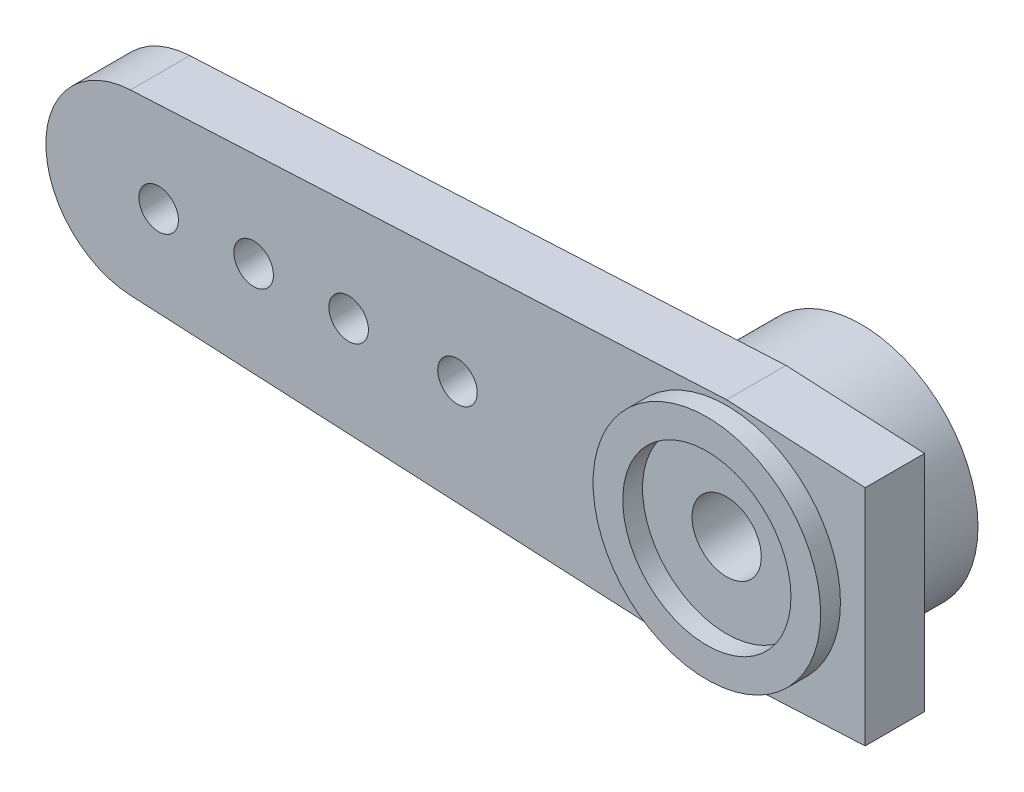
ISO-10303-21;
HEADER;
FILE_DESCRIPTION(('STEP AP214'),'2;1');
FILE_NAME('part.step','',(''),(''),'','','');
FILE_SCHEMA(('AUTOMOTIVE_DESIGN { 1 0 10303 214 1 1 1 1 }'));
ENDSEC;
DATA;
#1=APPLICATION_CONTEXT('core data for automotive mechanical design processes');
#2=APPLICATION_PROTOCOL_DEFINITION('international standard','automotive_design',2000,#1);
#3=PRODUCT_CONTEXT('',#1,'mechanical');
#4=PRODUCT('Part','Part','',(#3));
#5=PRODUCT_RELATED_PRODUCT_CATEGORY('part','',(#4));
#6=PRODUCT_DEFINITION_FORMATION('','',#4);
#7=PRODUCT_DEFINITION_CONTEXT('part definition',#1,'design');
#8=PRODUCT_DEFINITION('design','',#6,#7);
#9=PRODUCT_DEFINITION_SHAPE('','',#8);
#10=(LENGTH_UNIT() NAMED_UNIT(*) SI_UNIT(.MILLI.,.METRE.));
#11=(NAMED_UNIT(*) PLANE_ANGLE_UNIT() SI_UNIT($,.RADIAN.));
#12=(NAMED_UNIT(*) SI_UNIT($,.STERADIAN.) SOLID_ANGLE_UNIT());
#13=UNCERTAINTY_MEASURE_WITH_UNIT(LENGTH_MEASURE(1.E-05),#10,'distance_accuracy_value','');
#14=(GEOMETRIC_REPRESENTATION_CONTEXT(3) GLOBAL_UNCERTAINTY_ASSIGNED_CONTEXT((#13)) GLOBAL_UNIT_ASSIGNED_CONTEXT((#10,
#11,#12)) REPRESENTATION_CONTEXT('',''));
#15=CARTESIAN_POINT('',(0.,0.,0.));
#16=DIRECTION('',(0.,0.,1.));
#17=DIRECTION('',(1.,0.,0.));
#18=AXIS2_PLACEMENT_3D('',#15,#16,#17);
#19=CARTESIAN_POINT('',(14.95,0.,3.4));
#20=DIRECTION('',(0.,0.,1.));
#21=DIRECTION('',(1.,0.,0.));
#22=AXIS2_PLACEMENT_3D('',#19,#20,#21);
#23=PLANE('',#22);
#24=CARTESIAN_POINT('',(0.,0.,3.4));
#25=DIRECTION('',(0.,0.,1.));
#26=DIRECTION('',(1.,0.,0.));
#27=AXIS2_PLACEMENT_3D('',#24,#25,#26);
#28=CIRCLE('',#27,0.875);
#29=CARTESIAN_POINT('',(0.875,0.,3.4));
#30=VERTEX_POINT('',#29);
#31=EDGE_CURVE('E127',#30,#30,#28,.T.);
#32=ORIENTED_EDGE('',*,*,#31,.F.);
#33=EDGE_LOOP('',(#32));
#34=FACE_BOUND('',#33,.T.);
#35=CARTESIAN_POINT('',(0.,0.,3.4));
#36=DIRECTION('',(0.,0.,1.));
#37=DIRECTION('',(1.,0.,0.));
#38=AXIS2_PLACEMENT_3D('',#35,#36,#37);
#39=CIRCLE('',#38,2.125);
#40=CARTESIAN_POINT('',(2.125,0.,3.4));
#41=VERTEX_POINT('',#40);
#42=EDGE_CURVE('E42',#41,#41,#39,.F.);
#43=ORIENTED_EDGE('',*,*,#42,.F.);
#44=EDGE_LOOP('',(#43));
#45=FACE_BOUND('',#44,.T.);
#46=ADVANCED_FACE('F34',(#34,#45),#23,.T.);
#47=CARTESIAN_POINT('',(0.,0.,0.));
#48=DIRECTION('',(0.,0.,1.));
#49=DIRECTION('',(1.,0.,0.));
#50=AXIS2_PLACEMENT_3D('',#47,#48,#49);
#51=PLANE('',#50);
#52=CARTESIAN_POINT('',(0.,0.,0.));
#53=DIRECTION('',(0.,0.,1.));
#54=DIRECTION('',(1.,0.,0.));
#55=AXIS2_PLACEMENT_3D('',#52,#53,#54);
#56=CIRCLE('',#55,2.95);
#57=CARTESIAN_POINT('',(-2.95,0.,0.));
#58=VERTEX_POINT('',#57);
#59=EDGE_CURVE('E145',#58,#58,#56,.T.);
#60=ORIENTED_EDGE('',*,*,#59,.F.);
#61=EDGE_LOOP('',(#60));
#62=FACE_BOUND('',#61,.T.);
#63=CARTESIAN_POINT('',(0.,0.,0.));
#64=DIRECTION('',(0.,0.,1.));
#65=DIRECTION('',(1.,0.,0.));
#66=AXIS2_PLACEMENT_3D('',#63,#64,#65);
#67=CIRCLE('',#66,2.25);
#68=CARTESIAN_POINT('',(-2.25,0.,0.));
#69=VERTEX_POINT('',#68);
#70=EDGE_CURVE('E142',#69,#69,#67,.T.);
#71=ORIENTED_EDGE('',*,*,#70,.T.);
#72=EDGE_LOOP('',(#71));
#73=FACE_BOUND('',#72,.T.);
#74=ADVANCED_FACE('F156',(#62,#73),#51,.F.);
#75=CARTESIAN_POINT('',(0.,0.,1.9));
#76=DIRECTION('',(0.,0.,-1.));
#77=DIRECTION('',(-1.,0.,0.));
#78=AXIS2_PLACEMENT_3D('',#75,#76,#77);
#79=CYLINDRICAL_SURFACE('',#78,2.95);
#80=CARTESIAN_POINT('',(0.,0.,1.9));
#81=DIRECTION('',(0.,0.,1.));
#82=DIRECTION('',(1.,0.,0.));
#83=AXIS2_PLACEMENT_3D('',#80,#81,#82);
#84=CIRCLE('',#83,2.95);
#85=CARTESIAN_POINT('',(-2.95,0.,1.9));
#86=VERTEX_POINT('',#85);
#87=EDGE_CURVE('E146',#86,#86,#84,.T.);
#88=CARTESIAN_POINT('',(-2.95,0.,1.9));
#89=CARTESIAN_POINT('',(-2.95,0.,1.88020833333333));
#90=CARTESIAN_POINT('',(-2.95,0.,1.86041666666667));
#91=CARTESIAN_POINT('',(-2.95,0.,1.82083333333333));
#92=CARTESIAN_POINT('',(-2.95,0.,1.80104166666667));
#93=CARTESIAN_POINT('',(-2.95,0.,1.76145833333333));
#94=CARTESIAN_POINT('',(-2.95,0.,1.74166666666667));
#95=CARTESIAN_POINT('',(-2.95,0.,1.70208333333333));
#96=CARTESIAN_POINT('',(-2.95,0.,1.68229166666667));
#97=CARTESIAN_POINT('',(-2.95,0.,1.64270833333333));
#98=CARTESIAN_POINT('',(-2.95,0.,1.62291666666667));
#99=CARTESIAN_POINT('',(-2.95,0.,1.58333333333333));
#100=CARTESIAN_POINT('',(-2.95,0.,1.56354166666667));
#101=CARTESIAN_POINT('',(-2.95,0.,1.52395833333333));
#102=CARTESIAN_POINT('',(-2.95,0.,1.50416666666667));
#103=CARTESIAN_POINT('',(-2.95,0.,1.46458333333333));
#104=CARTESIAN_POINT('',(-2.95,0.,1.44479166666667));
#105=CARTESIAN_POINT('',(-2.95,0.,1.40520833333333));
#106=CARTESIAN_POINT('',(-2.95,0.,1.38541666666667));
#107=CARTESIAN_POINT('',(-2.95,0.,1.34583333333333));
#108=CARTESIAN_POINT('',(-2.95,0.,1.32604166666667));
#109=CARTESIAN_POINT('',(-2.95,0.,1.28645833333333));
#110=CARTESIAN_POINT('',(-2.95,0.,1.26666666666667));
#111=CARTESIAN_POINT('',(-2.95,0.,1.22708333333333));
#112=CARTESIAN_POINT('',(-2.95,0.,1.20729166666667));
#113=CARTESIAN_POINT('',(-2.95,0.,1.16770833333333));
#114=CARTESIAN_POINT('',(-2.95,0.,1.14791666666667));
#115=CARTESIAN_POINT('',(-2.95,0.,1.10833333333333));
#116=CARTESIAN_POINT('',(-2.95,0.,1.08854166666667));
#117=CARTESIAN_POINT('',(-2.95,0.,1.04895833333333));
#118=CARTESIAN_POINT('',(-2.95,0.,1.02916666666667));
#119=CARTESIAN_POINT('',(-2.95,0.,0.989583333333333));
#120=CARTESIAN_POINT('',(-2.95,0.,0.969791666666667));
#121=CARTESIAN_POINT('',(-2.95,0.,0.930208333333333));
#122=CARTESIAN_POINT('',(-2.95,0.,0.910416666666667));
#123=CARTESIAN_POINT('',(-2.95,0.,0.870833333333333));
#124=CARTESIAN_POINT('',(-2.95,0.,0.851041666666667));
#125=CARTESIAN_POINT('',(-2.95,0.,0.811458333333333));
#126=CARTESIAN_POINT('',(-2.95,0.,0.791666666666667));
#127=CARTESIAN_POINT('',(-2.95,0.,0.752083333333333));
#128=CARTESIAN_POINT('',(-2.95,0.,0.732291666666667));
#129=CARTESIAN_POINT('',(-2.95,0.,0.692708333333333));
#130=CARTESIAN_POINT('',(-2.95,0.,0.672916666666667));
#131=CARTESIAN_POINT('',(-2.95,0.,0.633333333333333));
#132=CARTESIAN_POINT('',(-2.95,0.,0.613541666666667));
#133=CARTESIAN_POINT('',(-2.95,0.,0.573958333333333));
#134=CARTESIAN_POINT('',(-2.95,0.,0.554166666666667));
#135=CARTESIAN_POINT('',(-2.95,0.,0.514583333333333));
#136=CARTESIAN_POINT('',(-2.95,0.,0.494791666666667));
#137=CARTESIAN_POINT('',(-2.95,0.,0.455208333333333));
#138=CARTESIAN_POINT('',(-2.95,0.,0.435416666666667));
#139=CARTESIAN_POINT('',(-2.95,0.,0.395833333333333));
#140=CARTESIAN_POINT('',(-2.95,0.,0.376041666666667));
#141=CARTESIAN_POINT('',(-2.95,0.,0.336458333333333));
#142=CARTESIAN_POINT('',(-2.95,0.,0.316666666666667));
#143=CARTESIAN_POINT('',(-2.95,0.,0.277083333333333));
#144=CARTESIAN_POINT('',(-2.95,0.,0.257291666666667));
#145=CARTESIAN_POINT('',(-2.95,0.,0.217708333333333));
#146=CARTESIAN_POINT('',(-2.95,0.,0.197916666666667));
#147=CARTESIAN_POINT('',(-2.95,0.,0.158333333333333));
#148=CARTESIAN_POINT('',(-2.95,0.,0.138541666666667));
#149=CARTESIAN_POINT('',(-2.95,0.,0.0989583333333333));
#150=CARTESIAN_POINT('',(-2.95,0.,0.0791666666666666));
#151=CARTESIAN_POINT('',(-2.95,0.,0.0395833333333333));
#152=CARTESIAN_POINT('',(-2.95,0.,0.0197916666666666));
#153=CARTESIAN_POINT('',(-2.95,0.,0.));
#154=B_SPLINE_CURVE_WITH_KNOTS('',3,(#88,#89,#90,#91,#92,#93,#94,#95,#96,#97,#98,#99,#100,#101,
#102,#103,#104,#105,#106,#107,#108,#109,#110,#111,#112,#113,#114,#115,#116,#117,#118,#119,#120,
#121,#122,#123,#124,#125,#126,#127,#128,#129,#130,#131,#132,#133,#134,#135,#136,#137,#138,#139,
#140,#141,#142,#143,#144,#145,#146,#147,#148,#149,#150,#151,#152,#153),.UNSPECIFIED.,.F.,.F.,(4,
2,2,2,2,2,2,2,2,2,2,2,2,2,2,2,2,2,2,2,2,2,2,2,2,2,2,2,2,2,2,2,4),(0.,0.059375,0.11875,0.178125,
0.2375,0.296875,0.35625,0.415625,0.475,0.534375,0.59375,0.653125,0.7125,0.771875,0.83125,
0.890625,0.95,1.009375,1.06875,1.128125,1.1875,1.246875,1.30625,1.365625,1.425,1.484375,1.54375,
1.603125,1.6625,1.721875,1.78125,1.840625,1.9),.UNSPECIFIED.);
#155=EDGE_CURVE('BSEAM36',#86,#58,#154,.T.);
#156=ORIENTED_EDGE('',*,*,#87,.F.);
#157=ORIENTED_EDGE('',*,*,#59,.T.);
#158=ORIENTED_EDGE('',*,*,#155,.T.);
#159=ORIENTED_EDGE('',*,*,#155,.F.);
#160=EDGE_LOOP('',(#156,#158,#157,#159));
#161=FACE_BOUND('',#160,.T.);
#162=ADVANCED_FACE('F36',(#161),#79,.T.);
#163=CARTESIAN_POINT('',(0.,0.,1.9));
#164=DIRECTION('',(0.,0.,-1.));
#165=DIRECTION('',(-1.,0.,0.));
#166=AXIS2_PLACEMENT_3D('',#163,#164,#165);
#167=CYLINDRICAL_SURFACE('',#166,2.25);
#168=CARTESIAN_POINT('',(0.,0.,1.9));
#169=DIRECTION('',(0.,0.,1.));
#170=DIRECTION('',(1.,0.,0.));
#171=AXIS2_PLACEMENT_3D('',#168,#169,#170);
#172=CIRCLE('',#171,2.25);
#173=CARTESIAN_POINT('',(-2.25,0.,1.9));
#174=VERTEX_POINT('',#173);
#175=EDGE_CURVE('E139',#174,#174,#172,.T.);
#176=CARTESIAN_POINT('',(-2.25,0.,1.9));
#177=CARTESIAN_POINT('',(-2.25,0.,1.88020833333333));
#178=CARTESIAN_POINT('',(-2.25,0.,1.86041666666667));
#179=CARTESIAN_POINT('',(-2.25,0.,1.82083333333333));
#180=CARTESIAN_POINT('',(-2.25,0.,1.80104166666667));
#181=CARTESIAN_POINT('',(-2.25,0.,1.76145833333333));
#182=CARTESIAN_POINT('',(-2.25,0.,1.74166666666667));
#183=CARTESIAN_POINT('',(-2.25,0.,1.70208333333333));
#184=CARTESIAN_POINT('',(-2.25,0.,1.68229166666667));
#185=CARTESIAN_POINT('',(-2.25,0.,1.64270833333333));
#186=CARTESIAN_POINT('',(-2.25,0.,1.62291666666667));
#187=CARTESIAN_POINT('',(-2.25,0.,1.58333333333333));
#188=CARTESIAN_POINT('',(-2.25,0.,1.56354166666667));
#189=CARTESIAN_POINT('',(-2.25,0.,1.52395833333333));
#190=CARTESIAN_POINT('',(-2.25,0.,1.50416666666667));
#191=CARTESIAN_POINT('',(-2.25,0.,1.46458333333333));
#192=CARTESIAN_POINT('',(-2.25,0.,1.44479166666667));
#193=CARTESIAN_POINT('',(-2.25,0.,1.40520833333333));
#194=CARTESIAN_POINT('',(-2.25,0.,1.38541666666667));
#195=CARTESIAN_POINT('',(-2.25,0.,1.34583333333333));
#196=CARTESIAN_POINT('',(-2.25,0.,1.32604166666667));
#197=CARTESIAN_POINT('',(-2.25,0.,1.28645833333333));
#198=CARTESIAN_POINT('',(-2.25,0.,1.26666666666667));
#199=CARTESIAN_POINT('',(-2.25,0.,1.22708333333333));
#200=CARTESIAN_POINT('',(-2.25,0.,1.20729166666667));
#201=CARTESIAN_POINT('',(-2.25,0.,1.16770833333333));
#202=CARTESIAN_POINT('',(-2.25,0.,1.14791666666667));
#203=CARTESIAN_POINT('',(-2.25,0.,1.10833333333333));
#204=CARTESIAN_POINT('',(-2.25,0.,1.08854166666667));
#205=CARTESIAN_POINT('',(-2.25,0.,1.04895833333333));
#206=CARTESIAN_POINT('',(-2.25,0.,1.02916666666667));
#207=CARTESIAN_POINT('',(-2.25,0.,0.989583333333333));
#208=CARTESIAN_POINT('',(-2.25,0.,0.969791666666667));
#209=CARTESIAN_POINT('',(-2.25,0.,0.930208333333333));
#210=CARTESIAN_POINT('',(-2.25,0.,0.910416666666667));
#211=CARTESIAN_POINT('',(-2.25,0.,0.870833333333333));
#212=CARTESIAN_POINT('',(-2.25,0.,0.851041666666667));
#213=CARTESIAN_POINT('',(-2.25,0.,0.811458333333333));
#214=CARTESIAN_POINT('',(-2.25,0.,0.791666666666667));
#215=CARTESIAN_POINT('',(-2.25,0.,0.752083333333333));
#216=CARTESIAN_POINT('',(-2.25,0.,0.732291666666667));
#217=CARTESIAN_POINT('',(-2.25,0.,0.692708333333333));
#218=CARTESIAN_POINT('',(-2.25,0.,0.672916666666667));
#219=CARTESIAN_POINT('',(-2.25,0.,0.633333333333333));
#220=CARTESIAN_POINT('',(-2.25,0.,0.613541666666667));
#221=CARTESIAN_POINT('',(-2.25,0.,0.573958333333333));
#222=CARTESIAN_POINT('',(-2.25,0.,0.554166666666667));
#223=CARTESIAN_POINT('',(-2.25,0.,0.514583333333333));
#224=CARTESIAN_POINT('',(-2.25,0.,0.494791666666667));
#225=CARTESIAN_POINT('',(-2.25,0.,0.455208333333333));
#226=CARTESIAN_POINT('',(-2.25,0.,0.435416666666667));
#227=CARTESIAN_POINT('',(-2.25,0.,0.395833333333333));
#228=CARTESIAN_POINT('',(-2.25,0.,0.376041666666667));
#229=CARTESIAN_POINT('',(-2.25,0.,0.336458333333333));
#230=CARTESIAN_POINT('',(-2.25,0.,0.316666666666667));
#231=CARTESIAN_POINT('',(-2.25,0.,0.277083333333333));
#232=CARTESIAN_POINT('',(-2.25,0.,0.257291666666667));
#233=CARTESIAN_POINT('',(-2.25,0.,0.217708333333333));
#234=CARTESIAN_POINT('',(-2.25,0.,0.197916666666667));
#235=CARTESIAN_POINT('',(-2.25,0.,0.158333333333333));
#236=CARTESIAN_POINT('',(-2.25,0.,0.138541666666667));
#237=CARTESIAN_POINT('',(-2.25,0.,0.0989583333333333));
#238=CARTESIAN_POINT('',(-2.25,0.,0.0791666666666666));
#239=CARTESIAN_POINT('',(-2.25,0.,0.0395833333333333));
#240=CARTESIAN_POINT('',(-2.25,0.,0.0197916666666666));
#241=CARTESIAN_POINT('',(-2.25,0.,0.));
#242=B_SPLINE_CURVE_WITH_KNOTS('',3,(#176,#177,#178,#179,#180,#181,#182,#183,#184,#185,#186,
#187,#188,#189,#190,#191,#192,#193,#194,#195,#196,#197,#198,#199,#200,#201,#202,#203,#204,#205,
#206,#207,#208,#209,#210,#211,#212,#213,#214,#215,#216,#217,#218,#219,#220,#221,#222,#223,#224,
#225,#226,#227,#228,#229,#230,#231,#232,#233,#234,#235,#236,#237,#238,#239,#240,#241),
.UNSPECIFIED.,.F.,.F.,(4,2,2,2,2,2,2,2,2,2,2,2,2,2,2,2,2,2,2,2,2,2,2,2,2,2,2,2,2,2,2,2,4),(0.,
0.059375,0.11875,0.178125,0.2375,0.296875,0.35625,0.415625,0.475,0.534375,0.59375,0.653125,
0.7125,0.771875,0.83125,0.890625,0.95,1.009375,1.06875,1.128125,1.1875,1.246875,1.30625,
1.365625,1.425,1.484375,1.54375,1.603125,1.6625,1.721875,1.78125,1.840625,1.9),.UNSPECIFIED.);
#243=EDGE_CURVE('BSEAM174',#174,#69,#242,.T.);
#244=ORIENTED_EDGE('',*,*,#175,.T.);
#245=ORIENTED_EDGE('',*,*,#70,.F.);
#246=ORIENTED_EDGE('',*,*,#243,.T.);
#247=ORIENTED_EDGE('',*,*,#243,.F.);
#248=EDGE_LOOP('',(#244,#246,#245,#247));
#249=FACE_BOUND('',#248,.T.);
#250=ADVANCED_FACE('F174',(#249),#167,.F.);
#251=CARTESIAN_POINT('',(14.95,0.,1.9));
#252=DIRECTION('',(0.,0.,1.));
#253=DIRECTION('',(1.,0.,0.));
#254=AXIS2_PLACEMENT_3D('',#251,#252,#253);
#255=PLANE('',#254);
#256=CARTESIAN_POINT('',(0.,0.,1.9));
#257=DIRECTION('',(0.,0.,1.));
#258=DIRECTION('',(1.,0.,0.));
#259=AXIS2_PLACEMENT_3D('',#256,#257,#258);
#260=CIRCLE('',#259,0.875);
#261=CARTESIAN_POINT('',(0.875,0.,1.9));
#262=VERTEX_POINT('',#261);
#263=EDGE_CURVE('E117',#262,#262,#260,.T.);
#264=ORIENTED_EDGE('',*,*,#263,.T.);
#265=EDGE_LOOP('',(#264));
#266=FACE_BOUND('',#265,.T.);
#267=ORIENTED_EDGE('',*,*,#175,.F.);
#268=EDGE_LOOP('',(#267));
#269=FACE_BOUND('',#268,.T.);
#270=ADVANCED_FACE('F168',(#266,#269),#255,.F.);
#271=DIRECTION('',(0.,-1.,0.));
#272=VECTOR('',#271,1.);
#273=CARTESIAN_POINT('',(3.5,2.82507220694701,3.4));
#274=LINE('',#273,#272);
#275=CARTESIAN_POINT('',(3.5,2.82507220694701,3.4));
#276=VERTEX_POINT('',#275);
#277=CARTESIAN_POINT('',(3.5,-2.82507220694701,3.4));
#278=VERTEX_POINT('',#277);
#279=EDGE_CURVE('E49',#276,#278,#274,.T.);
#280=ORIENTED_EDGE('',*,*,#279,.F.);
#281=DIRECTION('',(-0.998753366339054,0.0499170634794085,0.));
#282=VECTOR('',#281,1.);
#283=CARTESIAN_POINT('',(15.0623133928287,2.24719507426287,3.4));
#284=LINE('',#283,#282);
#285=CARTESIAN_POINT('',(0.,3.,3.4));
#286=VERTEX_POINT('',#285);
#287=EDGE_CURVE('E84',#276,#286,#284,.T.);
#288=ORIENTED_EDGE('',*,*,#287,.T.);
#289=DIRECTION('',(-0.998753366339054,-0.0499170634794085,0.));
#290=VECTOR('',#289,1.);
#291=CARTESIAN_POINT('',(-15.0623133928287,2.24719507426287,3.4));
#292=LINE('',#291,#290);
#293=CARTESIAN_POINT('',(-15.0623133928287,2.24719507426287,3.4));
#294=VERTEX_POINT('',#293);
#295=EDGE_CURVE('E109',#286,#294,#292,.T.);
#296=ORIENTED_EDGE('',*,*,#295,.T.);
#297=CARTESIAN_POINT('',(-14.95,0.,3.4));
#298=DIRECTION('',(0.,0.,1.));
#299=DIRECTION('',(-1.,0.,0.));
#300=AXIS2_PLACEMENT_3D('',#297,#298,#299);
#301=CIRCLE('',#300,2.25);
#302=CARTESIAN_POINT('',(-15.0623133928287,-2.24719507426288,3.4));
#303=VERTEX_POINT('',#302);
#304=EDGE_CURVE('E112',#294,#303,#301,.T.);
#305=ORIENTED_EDGE('',*,*,#304,.T.);
#306=DIRECTION('',(0.998753366339054,-0.0499170634794085,0.));
#307=VECTOR('',#306,1.);
#308=CARTESIAN_POINT('',(-15.0623133928287,-2.24719507426287,3.4));
#309=LINE('',#308,#307);
#310=CARTESIAN_POINT('',(0.,-3.,3.4));
#311=VERTEX_POINT('',#310);
#312=EDGE_CURVE('E57',#303,#311,#309,.T.);
#313=ORIENTED_EDGE('',*,*,#312,.T.);
#314=DIRECTION('',(0.998753366339054,0.0499170634794085,0.));
#315=VECTOR('',#314,1.);
#316=CARTESIAN_POINT('',(15.0623133928287,-2.24719507426287,3.4));
#317=LINE('',#316,#315);
#318=EDGE_CURVE('E103',#311,#278,#317,.T.);
#319=ORIENTED_EDGE('',*,*,#318,.T.);
#320=EDGE_LOOP('',(#280,#288,#296,#305,#313,#319));
#321=FACE_BOUND('',#320,.T.);
#322=CARTESIAN_POINT('',(0.,0.,3.4));
#323=DIRECTION('',(0.,0.,1.));
#324=DIRECTION('',(1.,0.,0.));
#325=AXIS2_PLACEMENT_3D('',#322,#323,#324);
#326=CIRCLE('',#325,2.875);
#327=CARTESIAN_POINT('',(2.875,0.,3.4));
#328=VERTEX_POINT('',#327);
#329=EDGE_CURVE('E385',#328,#328,#326,.T.);
#330=ORIENTED_EDGE('',*,*,#329,.F.);
#331=EDGE_LOOP('',(#330));
#332=FACE_BOUND('',#331,.T.);
#333=CARTESIAN_POINT('',(-9.55,0.,3.4));
#334=DIRECTION('',(0.,0.,1.));
#335=DIRECTION('',(-1.,0.,0.));
#336=AXIS2_PLACEMENT_3D('',#333,#334,#335);
#337=CIRCLE('',#336,0.500000000000001);
#338=CARTESIAN_POINT('',(-10.05,0.,3.4));
#339=VERTEX_POINT('',#338);
#340=EDGE_CURVE('E389',#339,#339,#337,.T.);
#341=ORIENTED_EDGE('',*,*,#340,.F.);
#342=EDGE_LOOP('',(#341));
#343=FACE_BOUND('',#342,.T.);
#344=CARTESIAN_POINT('',(-14.35,0.,3.4));
#345=DIRECTION('',(0.,0.,1.));
#346=DIRECTION('',(-1.,0.,0.));
#347=AXIS2_PLACEMENT_3D('',#344,#345,#346);
#348=CIRCLE('',#347,0.500000000000001);
#349=CARTESIAN_POINT('',(-14.85,0.,3.4));
#350=VERTEX_POINT('',#349);
#351=EDGE_CURVE('E397',#350,#350,#348,.T.);
#352=ORIENTED_EDGE('',*,*,#351,.F.);
#353=EDGE_LOOP('',(#352));
#354=FACE_BOUND('',#353,.T.);
#355=CARTESIAN_POINT('',(-11.95,0.,3.4));
#356=DIRECTION('',(0.,0.,1.));
#357=DIRECTION('',(-1.,0.,0.));
#358=AXIS2_PLACEMENT_3D('',#355,#356,#357);
#359=CIRCLE('',#358,0.500000000000001);
#360=CARTESIAN_POINT('',(-12.45,0.,3.4));
#361=VERTEX_POINT('',#360);
#362=EDGE_CURVE('E393',#361,#361,#359,.T.);
#363=ORIENTED_EDGE('',*,*,#362,.F.);
#364=EDGE_LOOP('',(#363));
#365=FACE_BOUND('',#364,.T.);
#366=CARTESIAN_POINT('',(-6.8,0.,3.4));
#367=DIRECTION('',(0.,0.,1.));
#368=DIRECTION('',(-1.,0.,0.));
#369=AXIS2_PLACEMENT_3D('',#366,#367,#368);
#370=CIRCLE('',#369,0.500000000000001);
#371=CARTESIAN_POINT('',(-7.3,0.,3.4));
#372=VERTEX_POINT('',#371);
#373=EDGE_CURVE('E379',#372,#372,#370,.T.);
#374=ORIENTED_EDGE('',*,*,#373,.F.);
#375=EDGE_LOOP('',(#374));
#376=FACE_BOUND('',#375,.T.);
#377=ADVANCED_FACE('F100',(#321,#332,#343,#354,#365,#376),#23,.T.);
#378=ORIENTED_EDGE('',*,*,#87,.T.);
#379=EDGE_LOOP('',(#378));
#380=FACE_BOUND('',#379,.T.);
#381=DIRECTION('',(-0.998753366339054,0.0499170634794085,0.));
#382=VECTOR('',#381,1.);
#383=CARTESIAN_POINT('',(15.0623133928287,2.24719507426287,1.9));
#384=LINE('',#383,#382);
#385=CARTESIAN_POINT('',(3.5,2.82507220694701,1.9));
#386=VERTEX_POINT('',#385);
#387=CARTESIAN_POINT('',(0.,3.,1.9));
#388=VERTEX_POINT('',#387);
#389=EDGE_CURVE('E124',#386,#388,#384,.T.);
#390=ORIENTED_EDGE('',*,*,#389,.F.);
#391=DIRECTION('',(0.,-1.,0.));
#392=VECTOR('',#391,1.);
#393=CARTESIAN_POINT('',(3.5,0.,1.9));
#394=LINE('',#393,#392);
#395=CARTESIAN_POINT('',(3.5,-2.82507220694701,1.9));
#396=VERTEX_POINT('',#395);
#397=EDGE_CURVE('E96',#386,#396,#394,.T.);
#398=ORIENTED_EDGE('',*,*,#397,.T.);
#399=DIRECTION('',(0.998753366339054,0.0499170634794085,0.));
#400=VECTOR('',#399,1.);
#401=CARTESIAN_POINT('',(15.0623133928287,-2.24719507426287,1.9));
#402=LINE('',#401,#400);
#403=CARTESIAN_POINT('',(0.,-3.,1.9));
#404=VERTEX_POINT('',#403);
#405=EDGE_CURVE('E110',#404,#396,#402,.T.);
#406=ORIENTED_EDGE('',*,*,#405,.F.);
#407=DIRECTION('',(0.998753366339054,-0.0499170634794085,0.));
#408=VECTOR('',#407,1.);
#409=CARTESIAN_POINT('',(-15.0623133928287,-2.24719507426287,1.9));
#410=LINE('',#409,#408);
#411=CARTESIAN_POINT('',(-15.0623133928287,-2.24719507426288,1.9));
#412=VERTEX_POINT('',#411);
#413=EDGE_CURVE('E78',#412,#404,#410,.T.);
#414=ORIENTED_EDGE('',*,*,#413,.F.);
#415=CARTESIAN_POINT('',(-14.95,0.,1.9));
#416=DIRECTION('',(0.,0.,1.));
#417=DIRECTION('',(-1.,0.,0.));
#418=AXIS2_PLACEMENT_3D('',#415,#416,#417);
#419=CIRCLE('',#418,2.25);
#420=CARTESIAN_POINT('',(-15.0623133928287,2.24719507426287,1.9));
#421=VERTEX_POINT('',#420);
#422=EDGE_CURVE('E129',#421,#412,#419,.T.);
#423=ORIENTED_EDGE('',*,*,#422,.F.);
#424=DIRECTION('',(-0.998753366339054,-0.0499170634794085,0.));
#425=VECTOR('',#424,1.);
#426=CARTESIAN_POINT('',(-15.0623133928287,2.24719507426287,1.9));
#427=LINE('',#426,#425);
#428=EDGE_CURVE('E126',#388,#421,#427,.T.);
#429=ORIENTED_EDGE('',*,*,#428,.F.);
#430=EDGE_LOOP('',(#390,#398,#406,#414,#423,#429));
#431=FACE_BOUND('',#430,.T.);
#432=CARTESIAN_POINT('',(-14.35,0.,1.9));
#433=DIRECTION('',(0.,0.,1.));
#434=DIRECTION('',(-1.,0.,0.));
#435=AXIS2_PLACEMENT_3D('',#432,#433,#434);
#436=CIRCLE('',#435,0.500000000000001);
#437=CARTESIAN_POINT('',(-14.85,0.,1.9));
#438=VERTEX_POINT('',#437);
#439=EDGE_CURVE('E366',#438,#438,#436,.T.);
#440=ORIENTED_EDGE('',*,*,#439,.T.);
#441=EDGE_LOOP('',(#440));
#442=FACE_BOUND('',#441,.T.);
#443=CARTESIAN_POINT('',(-11.95,0.,1.9));
#444=DIRECTION('',(0.,0.,1.));
#445=DIRECTION('',(-1.,0.,0.));
#446=AXIS2_PLACEMENT_3D('',#443,#444,#445);
#447=CIRCLE('',#446,0.500000000000001);
#448=CARTESIAN_POINT('',(-12.45,0.,1.9));
#449=VERTEX_POINT('',#448);
#450=EDGE_CURVE('E370',#449,#449,#447,.T.);
#451=ORIENTED_EDGE('',*,*,#450,.T.);
#452=EDGE_LOOP('',(#451));
#453=FACE_BOUND('',#452,.T.);
#454=CARTESIAN_POINT('',(-9.55,0.,1.9));
#455=DIRECTION('',(0.,0.,1.));
#456=DIRECTION('',(-1.,0.,0.));
#457=AXIS2_PLACEMENT_3D('',#454,#455,#456);
#458=CIRCLE('',#457,0.500000000000001);
#459=CARTESIAN_POINT('',(-10.05,0.,1.9));
#460=VERTEX_POINT('',#459);
#461=EDGE_CURVE('E374',#460,#460,#458,.T.);
#462=ORIENTED_EDGE('',*,*,#461,.T.);
#463=EDGE_LOOP('',(#462));
#464=FACE_BOUND('',#463,.T.);
#465=CARTESIAN_POINT('',(-6.8,0.,1.9));
#466=DIRECTION('',(0.,0.,1.));
#467=DIRECTION('',(-1.,0.,0.));
#468=AXIS2_PLACEMENT_3D('',#465,#466,#467);
#469=CIRCLE('',#468,0.500000000000001);
#470=CARTESIAN_POINT('',(-7.3,0.,1.9));
#471=VERTEX_POINT('',#470);
#472=EDGE_CURVE('E377',#471,#471,#469,.T.);
#473=ORIENTED_EDGE('',*,*,#472,.T.);
#474=EDGE_LOOP('',(#473));
#475=FACE_BOUND('',#474,.T.);
#476=ADVANCED_FACE('F167',(#380,#431,#442,#453,#464,#475),#255,.F.);
#477=CARTESIAN_POINT('',(15.0623133928287,2.24719507426287,3.4));
#478=DIRECTION('',(-0.0499170634794085,-0.998753366339054,0.));
#479=DIRECTION('',(0.998753366339054,-0.0499170634794085,0.));
#480=AXIS2_PLACEMENT_3D('',#477,#478,#479);
#481=PLANE('',#480);
#482=ORIENTED_EDGE('',*,*,#287,.F.);
#483=DIRECTION('',(0.,0.,1.));
#484=VECTOR('',#483,1.);
#485=CARTESIAN_POINT('',(3.5,2.82507220694701,-6.6));
#486=LINE('',#485,#484);
#487=EDGE_CURVE('E93',#386,#276,#486,.T.);
#488=ORIENTED_EDGE('',*,*,#487,.F.);
#489=ORIENTED_EDGE('',*,*,#389,.T.);
#490=DIRECTION('',(0.,0.,-1.));
#491=VECTOR('',#490,1.);
#492=CARTESIAN_POINT('',(0.,3.,3.4));
#493=LINE('',#492,#491);
#494=EDGE_CURVE('E107',#286,#388,#493,.T.);
#495=ORIENTED_EDGE('',*,*,#494,.F.);
#496=EDGE_LOOP('',(#482,#488,#489,#495));
#497=FACE_BOUND('',#496,.T.);
#498=ADVANCED_FACE('F105',(#497),#481,.F.);
#499=CARTESIAN_POINT('',(-15.0623133928287,2.24719507426287,3.4));
#500=DIRECTION('',(0.0499170634794085,-0.998753366339054,0.));
#501=DIRECTION('',(0.998753366339054,0.0499170634794085,0.));
#502=AXIS2_PLACEMENT_3D('',#499,#500,#501);
#503=PLANE('',#502);
#504=ORIENTED_EDGE('',*,*,#428,.T.);
#505=DIRECTION('',(0.,0.,-1.));
#506=VECTOR('',#505,1.);
#507=CARTESIAN_POINT('',(-15.0623133928287,2.24719507426287,3.4));
#508=LINE('',#507,#506);
#509=EDGE_CURVE('E135',#294,#421,#508,.T.);
#510=ORIENTED_EDGE('',*,*,#509,.F.);
#511=ORIENTED_EDGE('',*,*,#295,.F.);
#512=ORIENTED_EDGE('',*,*,#494,.T.);
#513=EDGE_LOOP('',(#504,#510,#511,#512));
#514=FACE_BOUND('',#513,.T.);
#515=ADVANCED_FACE('F195',(#514),#503,.F.);
#516=CARTESIAN_POINT('',(-14.95,0.,3.4));
#517=DIRECTION('',(0.,0.,-1.));
#518=DIRECTION('',(-1.,0.,0.));
#519=AXIS2_PLACEMENT_3D('',#516,#517,#518);
#520=CYLINDRICAL_SURFACE('',#519,2.25);
#521=ORIENTED_EDGE('',*,*,#422,.T.);
#522=DIRECTION('',(0.,0.,-1.));
#523=VECTOR('',#522,1.);
#524=CARTESIAN_POINT('',(-15.0623133928287,-2.24719507426288,3.4));
#525=LINE('',#524,#523);
#526=EDGE_CURVE('E133',#303,#412,#525,.T.);
#527=ORIENTED_EDGE('',*,*,#526,.F.);
#528=ORIENTED_EDGE('',*,*,#304,.F.);
#529=ORIENTED_EDGE('',*,*,#509,.T.);
#530=EDGE_LOOP('',(#521,#527,#528,#529));
#531=FACE_BOUND('',#530,.T.);
#532=ADVANCED_FACE('F192',(#531),#520,.T.);
#533=CARTESIAN_POINT('',(-15.0623133928287,-2.24719507426287,3.4));
#534=DIRECTION('',(0.0499170634794085,0.998753366339054,0.));
#535=DIRECTION('',(-0.998753366339054,0.0499170634794085,0.));
#536=AXIS2_PLACEMENT_3D('',#533,#534,#535);
#537=PLANE('',#536);
#538=ORIENTED_EDGE('',*,*,#413,.T.);
#539=DIRECTION('',(0.,0.,-1.));
#540=VECTOR('',#539,1.);
#541=CARTESIAN_POINT('',(0.,-3.,3.4));
#542=LINE('',#541,#540);
#543=EDGE_CURVE('E123',#311,#404,#542,.T.);
#544=ORIENTED_EDGE('',*,*,#543,.F.);
#545=ORIENTED_EDGE('',*,*,#312,.F.);
#546=ORIENTED_EDGE('',*,*,#526,.T.);
#547=EDGE_LOOP('',(#538,#544,#545,#546));
#548=FACE_BOUND('',#547,.T.);
#549=ADVANCED_FACE('F188',(#548),#537,.F.);
#550=CARTESIAN_POINT('',(15.0623133928287,-2.24719507426287,3.4));
#551=DIRECTION('',(-0.0499170634794085,0.998753366339054,0.));
#552=DIRECTION('',(-0.998753366339054,-0.0499170634794085,0.));
#553=AXIS2_PLACEMENT_3D('',#550,#551,#552);
#554=PLANE('',#553);
#555=ORIENTED_EDGE('',*,*,#405,.T.);
#556=DIRECTION('',(0.,0.,1.));
#557=VECTOR('',#556,1.);
#558=CARTESIAN_POINT('',(3.5,-2.82507220694701,3.4));
#559=LINE('',#558,#557);
#560=EDGE_CURVE('E11',#396,#278,#559,.T.);
#561=ORIENTED_EDGE('',*,*,#560,.T.);
#562=ORIENTED_EDGE('',*,*,#318,.F.);
#563=ORIENTED_EDGE('',*,*,#543,.T.);
#564=EDGE_LOOP('',(#555,#561,#562,#563));
#565=FACE_BOUND('',#564,.T.);
#566=ADVANCED_FACE('F184',(#565),#554,.F.);
#567=CARTESIAN_POINT('',(0.,0.,3.4));
#568=DIRECTION('',(0.,0.,-1.));
#569=DIRECTION('',(-1.,0.,0.));
#570=AXIS2_PLACEMENT_3D('',#567,#568,#569);
#571=CYLINDRICAL_SURFACE('',#570,0.875);
#572=ORIENTED_EDGE('',*,*,#31,.T.);
#573=EDGE_LOOP('',(#572));
#574=FACE_BOUND('',#573,.T.);
#575=ORIENTED_EDGE('',*,*,#263,.F.);
#576=EDGE_LOOP('',(#575));
#577=FACE_BOUND('',#576,.T.);
#578=ADVANCED_FACE('F187',(#574,#577),#571,.F.);
#579=CARTESIAN_POINT('',(-14.35,0.,3.4));
#580=DIRECTION('',(0.,0.,-1.));
#581=DIRECTION('',(-1.,0.,0.));
#582=AXIS2_PLACEMENT_3D('',#579,#580,#581);
#583=CYLINDRICAL_SURFACE('',#582,0.500000000000001);
#584=ORIENTED_EDGE('',*,*,#351,.T.);
#585=EDGE_LOOP('',(#584));
#586=FACE_BOUND('',#585,.T.);
#587=ORIENTED_EDGE('',*,*,#439,.F.);
#588=EDGE_LOOP('',(#587));
#589=FACE_BOUND('',#588,.T.);
#590=ADVANCED_FACE('F228',(#586,#589),#583,.F.);
#591=CARTESIAN_POINT('',(-11.95,0.,3.4));
#592=DIRECTION('',(0.,0.,-1.));
#593=DIRECTION('',(-1.,0.,0.));
#594=AXIS2_PLACEMENT_3D('',#591,#592,#593);
#595=CYLINDRICAL_SURFACE('',#594,0.500000000000001);
#596=ORIENTED_EDGE('',*,*,#362,.T.);
#597=EDGE_LOOP('',(#596));
#598=FACE_BOUND('',#597,.T.);
#599=ORIENTED_EDGE('',*,*,#450,.F.);
#600=EDGE_LOOP('',(#599));
#601=FACE_BOUND('',#600,.T.);
#602=ADVANCED_FACE('F235',(#598,#601),#595,.F.);
#603=CARTESIAN_POINT('',(-9.55,0.,3.4));
#604=DIRECTION('',(0.,0.,-1.));
#605=DIRECTION('',(-1.,0.,0.));
#606=AXIS2_PLACEMENT_3D('',#603,#604,#605);
#607=CYLINDRICAL_SURFACE('',#606,0.500000000000001);
#608=ORIENTED_EDGE('',*,*,#340,.T.);
#609=EDGE_LOOP('',(#608));
#610=FACE_BOUND('',#609,.T.);
#611=ORIENTED_EDGE('',*,*,#461,.F.);
#612=EDGE_LOOP('',(#611));
#613=FACE_BOUND('',#612,.T.);
#614=ADVANCED_FACE('F243',(#610,#613),#607,.F.);
#615=CARTESIAN_POINT('',(-6.8,0.,3.4));
#616=DIRECTION('',(0.,0.,-1.));
#617=DIRECTION('',(-1.,0.,0.));
#618=AXIS2_PLACEMENT_3D('',#615,#616,#617);
#619=CYLINDRICAL_SURFACE('',#618,0.500000000000001);
#620=ORIENTED_EDGE('',*,*,#373,.T.);
#621=EDGE_LOOP('',(#620));
#622=FACE_BOUND('',#621,.T.);
#623=ORIENTED_EDGE('',*,*,#472,.F.);
#624=EDGE_LOOP('',(#623));
#625=FACE_BOUND('',#624,.T.);
#626=ADVANCED_FACE('F251',(#622,#625),#619,.F.);
#627=CARTESIAN_POINT('',(0.,0.,3.9));
#628=DIRECTION('',(0.,0.,1.));
#629=DIRECTION('',(1.,0.,0.));
#630=AXIS2_PLACEMENT_3D('',#627,#628,#629);
#631=PLANE('',#630);
#632=CARTESIAN_POINT('',(0.,0.,3.9));
#633=DIRECTION('',(0.,0.,1.));
#634=DIRECTION('',(1.,0.,0.));
#635=AXIS2_PLACEMENT_3D('',#632,#633,#634);
#636=CIRCLE('',#635,2.875);
#637=CARTESIAN_POINT('',(2.875,0.,3.9));
#638=VERTEX_POINT('',#637);
#639=EDGE_CURVE('E380',#638,#638,#636,.T.);
#640=ORIENTED_EDGE('',*,*,#639,.T.);
#641=EDGE_LOOP('',(#640));
#642=FACE_BOUND('',#641,.T.);
#643=CARTESIAN_POINT('',(0.,0.,3.9));
#644=DIRECTION('',(0.,0.,1.));
#645=DIRECTION('',(1.,0.,0.));
#646=AXIS2_PLACEMENT_3D('',#643,#644,#645);
#647=CIRCLE('',#646,2.125);
#648=CARTESIAN_POINT('',(2.125,0.,3.9));
#649=VERTEX_POINT('',#648);
#650=EDGE_CURVE('E415',#649,#649,#647,.T.);
#651=ORIENTED_EDGE('',*,*,#650,.F.);
#652=EDGE_LOOP('',(#651));
#653=FACE_BOUND('',#652,.T.);
#654=ADVANCED_FACE('F259',(#642,#653),#631,.T.);
#655=CARTESIAN_POINT('',(0.,0.,3.9));
#656=DIRECTION('',(0.,0.,-1.));
#657=DIRECTION('',(-1.,0.,0.));
#658=AXIS2_PLACEMENT_3D('',#655,#656,#657);
#659=CYLINDRICAL_SURFACE('',#658,2.875);
#660=ORIENTED_EDGE('',*,*,#639,.F.);
#661=EDGE_LOOP('',(#660));
#662=FACE_BOUND('',#661,.T.);
#663=ORIENTED_EDGE('',*,*,#329,.T.);
#664=EDGE_LOOP('',(#663));
#665=FACE_BOUND('',#664,.T.);
#666=ADVANCED_FACE('F267',(#662,#665),#659,.T.);
#667=CARTESIAN_POINT('',(0.,0.,3.9));
#668=DIRECTION('',(0.,0.,-1.));
#669=DIRECTION('',(-1.,0.,0.));
#670=AXIS2_PLACEMENT_3D('',#667,#668,#669);
#671=CYLINDRICAL_SURFACE('',#670,2.125);
#672=ORIENTED_EDGE('',*,*,#650,.T.);
#673=EDGE_LOOP('',(#672));
#674=FACE_BOUND('',#673,.T.);
#675=ORIENTED_EDGE('',*,*,#42,.T.);
#676=EDGE_LOOP('',(#675));
#677=FACE_BOUND('',#676,.T.);
#678=ADVANCED_FACE('F153',(#674,#677),#671,.F.);
#679=CARTESIAN_POINT('',(3.5,2.82507220694701,-6.6));
#680=DIRECTION('',(-1.,0.,0.));
#681=DIRECTION('',(0.,-1.,0.));
#682=AXIS2_PLACEMENT_3D('',#679,#680,#681);
#683=PLANE('',#682);
#684=ORIENTED_EDGE('',*,*,#487,.T.);
#685=ORIENTED_EDGE('',*,*,#279,.T.);
#686=ORIENTED_EDGE('',*,*,#560,.F.);
#687=ORIENTED_EDGE('',*,*,#397,.F.);
#688=EDGE_LOOP('',(#684,#685,#686,#687));
#689=FACE_BOUND('',#688,.T.);
#690=ADVANCED_FACE('F94',(#689),#683,.F.);
#691=CLOSED_SHELL('',(#46,#74,#162,#250,#270,#377,#476,#498,#515,#532,#549,#566,#578,#590,#602,
#614,#626,#654,#666,#678,#690));
#692=MANIFOLD_SOLID_BREP('B2',#691);
#693=ADVANCED_BREP_SHAPE_REPRESENTATION('',(#18,#692),#14);
#694=SHAPE_DEFINITION_REPRESENTATION(#9,#693);
ENDSEC;
END-ISO-10303-21;
